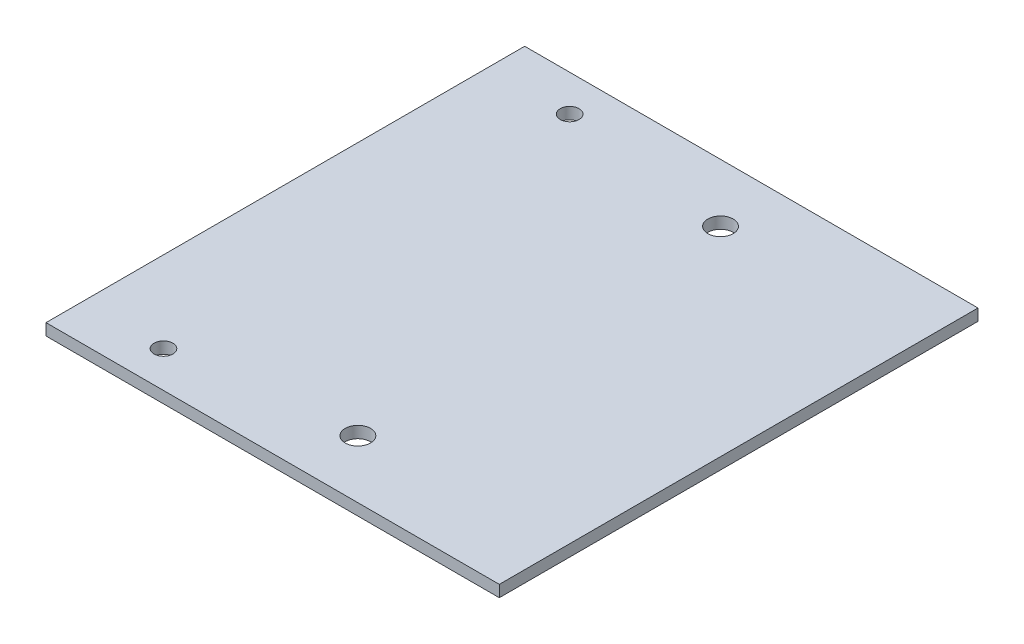
ISO-10303-21;
HEADER;
FILE_DESCRIPTION(('STEP AP214'),'2;1');
FILE_NAME('part.step','',(''),(''),'','','');
FILE_SCHEMA(('AUTOMOTIVE_DESIGN { 1 0 10303 214 1 1 1 1 }'));
ENDSEC;
DATA;
#1=APPLICATION_CONTEXT('core data for automotive mechanical design processes');
#2=APPLICATION_PROTOCOL_DEFINITION('international standard','automotive_design',2000,#1);
#3=PRODUCT_CONTEXT('',#1,'mechanical');
#4=PRODUCT('Part','Part','',(#3));
#5=PRODUCT_RELATED_PRODUCT_CATEGORY('part','',(#4));
#6=PRODUCT_DEFINITION_FORMATION('','',#4);
#7=PRODUCT_DEFINITION_CONTEXT('part definition',#1,'design');
#8=PRODUCT_DEFINITION('design','',#6,#7);
#9=PRODUCT_DEFINITION_SHAPE('','',#8);
#10=(LENGTH_UNIT() NAMED_UNIT(*) SI_UNIT(.MILLI.,.METRE.));
#11=(NAMED_UNIT(*) PLANE_ANGLE_UNIT() SI_UNIT($,.RADIAN.));
#12=(NAMED_UNIT(*) SI_UNIT($,.STERADIAN.) SOLID_ANGLE_UNIT());
#13=UNCERTAINTY_MEASURE_WITH_UNIT(LENGTH_MEASURE(1.E-05),#10,'distance_accuracy_value','');
#14=(GEOMETRIC_REPRESENTATION_CONTEXT(3) GLOBAL_UNCERTAINTY_ASSIGNED_CONTEXT((#13)) GLOBAL_UNIT_ASSIGNED_CONTEXT((#10,
#11,#12)) REPRESENTATION_CONTEXT('',''));
#15=CARTESIAN_POINT('',(0.,0.,0.));
#16=DIRECTION('',(0.,0.,1.));
#17=DIRECTION('',(1.,0.,0.));
#18=AXIS2_PLACEMENT_3D('',#15,#16,#17);
#19=CARTESIAN_POINT('',(31.25,1.6,33.));
#20=DIRECTION('',(-1.,0.,0.));
#21=DIRECTION('',(0.,0.,1.));
#22=AXIS2_PLACEMENT_3D('',#19,#20,#21);
#23=PLANE('',#22);
#24=DIRECTION('',(0.,0.,-1.));
#25=VECTOR('',#24,1.);
#26=CARTESIAN_POINT('',(31.25,0.,33.));
#27=LINE('',#26,#25);
#28=CARTESIAN_POINT('',(31.25,0.,33.));
#29=VERTEX_POINT('',#28);
#30=CARTESIAN_POINT('',(31.25,0.,-33.));
#31=VERTEX_POINT('',#30);
#32=EDGE_CURVE('E97',#29,#31,#27,.T.);
#33=ORIENTED_EDGE('',*,*,#32,.T.);
#34=DIRECTION('',(0.,-1.,0.));
#35=VECTOR('',#34,1.);
#36=CARTESIAN_POINT('',(31.25,1.6,-33.));
#37=LINE('',#36,#35);
#38=CARTESIAN_POINT('',(31.25,1.6,-33.));
#39=VERTEX_POINT('',#38);
#40=EDGE_CURVE('E11',#39,#31,#37,.T.);
#41=ORIENTED_EDGE('',*,*,#40,.F.);
#42=DIRECTION('',(0.,0.,-1.));
#43=VECTOR('',#42,1.);
#44=CARTESIAN_POINT('',(31.25,1.6,33.));
#45=LINE('',#44,#43);
#46=CARTESIAN_POINT('',(31.25,1.6,33.));
#47=VERTEX_POINT('',#46);
#48=EDGE_CURVE('E84',#47,#39,#45,.T.);
#49=ORIENTED_EDGE('',*,*,#48,.F.);
#50=DIRECTION('',(0.,-1.,0.));
#51=VECTOR('',#50,1.);
#52=CARTESIAN_POINT('',(31.25,1.6,33.));
#53=LINE('',#52,#51);
#54=EDGE_CURVE('E93',#47,#29,#53,.T.);
#55=ORIENTED_EDGE('',*,*,#54,.T.);
#56=EDGE_LOOP('',(#33,#41,#49,#55));
#57=FACE_BOUND('',#56,.T.);
#58=ADVANCED_FACE('F31',(#57),#23,.F.);
#59=CARTESIAN_POINT('',(-31.25,1.6,-33.));
#60=DIRECTION('',(0.,0.,1.));
#61=DIRECTION('',(1.,0.,0.));
#62=AXIS2_PLACEMENT_3D('',#59,#60,#61);
#63=PLANE('',#62);
#64=DIRECTION('',(-1.,0.,0.));
#65=VECTOR('',#64,1.);
#66=CARTESIAN_POINT('',(-31.25,0.,-33.));
#67=LINE('',#66,#65);
#68=CARTESIAN_POINT('',(-31.25,0.,-33.));
#69=VERTEX_POINT('',#68);
#70=EDGE_CURVE('E88',#31,#69,#67,.T.);
#71=ORIENTED_EDGE('',*,*,#70,.T.);
#72=DIRECTION('',(0.,-1.,0.));
#73=VECTOR('',#72,1.);
#74=CARTESIAN_POINT('',(-31.25,1.6,-33.));
#75=LINE('',#74,#73);
#76=CARTESIAN_POINT('',(-31.25,1.6,-33.));
#77=VERTEX_POINT('',#76);
#78=EDGE_CURVE('E40',#77,#69,#75,.T.);
#79=ORIENTED_EDGE('',*,*,#78,.F.);
#80=DIRECTION('',(-1.,0.,0.));
#81=VECTOR('',#80,1.);
#82=CARTESIAN_POINT('',(-31.25,1.6,-33.));
#83=LINE('',#82,#81);
#84=EDGE_CURVE('E79',#39,#77,#83,.T.);
#85=ORIENTED_EDGE('',*,*,#84,.F.);
#86=ORIENTED_EDGE('',*,*,#40,.T.);
#87=EDGE_LOOP('',(#71,#79,#85,#86));
#88=FACE_BOUND('',#87,.T.);
#89=ADVANCED_FACE('F87',(#88),#63,.F.);
#90=CARTESIAN_POINT('',(-31.25,1.6,33.));
#91=DIRECTION('',(1.,0.,0.));
#92=DIRECTION('',(0.,0.,-1.));
#93=AXIS2_PLACEMENT_3D('',#90,#91,#92);
#94=PLANE('',#93);
#95=DIRECTION('',(0.,0.,1.));
#96=VECTOR('',#95,1.);
#97=CARTESIAN_POINT('',(-31.25,0.,33.));
#98=LINE('',#97,#96);
#99=CARTESIAN_POINT('',(-31.25,0.,33.));
#100=VERTEX_POINT('',#99);
#101=EDGE_CURVE('E66',#69,#100,#98,.T.);
#102=ORIENTED_EDGE('',*,*,#101,.T.);
#103=DIRECTION('',(0.,-1.,0.));
#104=VECTOR('',#103,1.);
#105=CARTESIAN_POINT('',(-31.25,1.6,33.));
#106=LINE('',#105,#104);
#107=CARTESIAN_POINT('',(-31.25,1.6,33.));
#108=VERTEX_POINT('',#107);
#109=EDGE_CURVE('E89',#108,#100,#106,.T.);
#110=ORIENTED_EDGE('',*,*,#109,.F.);
#111=DIRECTION('',(0.,0.,1.));
#112=VECTOR('',#111,1.);
#113=CARTESIAN_POINT('',(-31.25,1.6,33.));
#114=LINE('',#113,#112);
#115=EDGE_CURVE('E82',#77,#108,#114,.T.);
#116=ORIENTED_EDGE('',*,*,#115,.F.);
#117=ORIENTED_EDGE('',*,*,#78,.T.);
#118=EDGE_LOOP('',(#102,#110,#116,#117));
#119=FACE_BOUND('',#118,.T.);
#120=ADVANCED_FACE('F91',(#119),#94,.F.);
#121=CARTESIAN_POINT('',(-31.25,1.6,33.));
#122=DIRECTION('',(0.,0.,-1.));
#123=DIRECTION('',(-1.,0.,0.));
#124=AXIS2_PLACEMENT_3D('',#121,#122,#123);
#125=PLANE('',#124);
#126=DIRECTION('',(1.,0.,0.));
#127=VECTOR('',#126,1.);
#128=CARTESIAN_POINT('',(-31.25,0.,33.));
#129=LINE('',#128,#127);
#130=EDGE_CURVE('E72',#100,#29,#129,.T.);
#131=ORIENTED_EDGE('',*,*,#130,.T.);
#132=ORIENTED_EDGE('',*,*,#54,.F.);
#133=DIRECTION('',(1.,0.,0.));
#134=VECTOR('',#133,1.);
#135=CARTESIAN_POINT('',(-31.25,1.6,33.));
#136=LINE('',#135,#134);
#137=EDGE_CURVE('E49',#108,#47,#136,.T.);
#138=ORIENTED_EDGE('',*,*,#137,.F.);
#139=ORIENTED_EDGE('',*,*,#109,.T.);
#140=EDGE_LOOP('',(#131,#132,#138,#139));
#141=FACE_BOUND('',#140,.T.);
#142=ADVANCED_FACE('F136',(#141),#125,.F.);
#143=CARTESIAN_POINT('',(31.25,1.6,-33.));
#144=DIRECTION('',(0.,-1.,0.));
#145=DIRECTION('',(0.,0.,-1.));
#146=AXIS2_PLACEMENT_3D('',#143,#144,#145);
#147=PLANE('',#146);
#148=CARTESIAN_POINT('',(3.75,1.6,25.));
#149=DIRECTION('',(0.,1.,0.));
#150=DIRECTION('',(0.,0.,1.));
#151=AXIS2_PLACEMENT_3D('',#148,#149,#150);
#152=CIRCLE('',#151,1.75);
#153=CARTESIAN_POINT('',(3.75,1.6,26.75));
#154=VERTEX_POINT('',#153);
#155=EDGE_CURVE('E122',#154,#154,#152,.T.);
#156=ORIENTED_EDGE('',*,*,#155,.F.);
#157=EDGE_LOOP('',(#156));
#158=FACE_BOUND('',#157,.T.);
#159=CARTESIAN_POINT('',(3.75,1.6,-25.));
#160=DIRECTION('',(0.,1.,0.));
#161=DIRECTION('',(0.,0.,1.));
#162=AXIS2_PLACEMENT_3D('',#159,#160,#161);
#163=CIRCLE('',#162,1.75);
#164=CARTESIAN_POINT('',(3.75,1.6,-23.25));
#165=VERTEX_POINT('',#164);
#166=EDGE_CURVE('E118',#165,#165,#163,.T.);
#167=ORIENTED_EDGE('',*,*,#166,.F.);
#168=EDGE_LOOP('',(#167));
#169=FACE_BOUND('',#168,.T.);
#170=CARTESIAN_POINT('',(-20.052,1.6,28.));
#171=DIRECTION('',(0.,1.,0.));
#172=DIRECTION('',(0.,0.,1.));
#173=AXIS2_PLACEMENT_3D('',#170,#171,#172);
#174=CIRCLE('',#173,1.3);
#175=CARTESIAN_POINT('',(-20.052,1.6,29.3));
#176=VERTEX_POINT('',#175);
#177=EDGE_CURVE('E114',#176,#176,#174,.T.);
#178=ORIENTED_EDGE('',*,*,#177,.F.);
#179=EDGE_LOOP('',(#178));
#180=FACE_BOUND('',#179,.T.);
#181=CARTESIAN_POINT('',(-20.052,1.6,-28.));
#182=DIRECTION('',(0.,1.,0.));
#183=DIRECTION('',(0.,0.,1.));
#184=AXIS2_PLACEMENT_3D('',#181,#182,#183);
#185=CIRCLE('',#184,1.3);
#186=CARTESIAN_POINT('',(-20.052,1.6,-26.7));
#187=VERTEX_POINT('',#186);
#188=EDGE_CURVE('E106',#187,#187,#185,.T.);
#189=ORIENTED_EDGE('',*,*,#188,.F.);
#190=EDGE_LOOP('',(#189));
#191=FACE_BOUND('',#190,.T.);
#192=ORIENTED_EDGE('',*,*,#48,.T.);
#193=ORIENTED_EDGE('',*,*,#84,.T.);
#194=ORIENTED_EDGE('',*,*,#115,.T.);
#195=ORIENTED_EDGE('',*,*,#137,.T.);
#196=EDGE_LOOP('',(#192,#193,#194,#195));
#197=FACE_BOUND('',#196,.T.);
#198=ADVANCED_FACE('F80',(#158,#169,#180,#191,#197),#147,.F.);
#199=CARTESIAN_POINT('',(31.25,0.,-33.));
#200=DIRECTION('',(0.,-1.,0.));
#201=DIRECTION('',(0.,0.,-1.));
#202=AXIS2_PLACEMENT_3D('',#199,#200,#201);
#203=PLANE('',#202);
#204=CARTESIAN_POINT('',(3.75,0.,25.));
#205=DIRECTION('',(0.,-1.,0.));
#206=DIRECTION('',(0.,0.,-1.));
#207=AXIS2_PLACEMENT_3D('',#204,#205,#206);
#208=CIRCLE('',#207,1.75);
#209=CARTESIAN_POINT('',(3.75,0.,23.25));
#210=VERTEX_POINT('',#209);
#211=EDGE_CURVE('E125',#210,#210,#208,.F.);
#212=ORIENTED_EDGE('',*,*,#211,.T.);
#213=EDGE_LOOP('',(#212));
#214=FACE_BOUND('',#213,.T.);
#215=CARTESIAN_POINT('',(3.75,0.,-25.));
#216=DIRECTION('',(0.,-1.,0.));
#217=DIRECTION('',(0.,0.,-1.));
#218=AXIS2_PLACEMENT_3D('',#215,#216,#217);
#219=CIRCLE('',#218,1.75);
#220=CARTESIAN_POINT('',(3.75,0.,-26.75));
#221=VERTEX_POINT('',#220);
#222=EDGE_CURVE('E119',#221,#221,#219,.F.);
#223=ORIENTED_EDGE('',*,*,#222,.T.);
#224=EDGE_LOOP('',(#223));
#225=FACE_BOUND('',#224,.T.);
#226=CARTESIAN_POINT('',(-20.052,0.,28.));
#227=DIRECTION('',(0.,-1.,0.));
#228=DIRECTION('',(0.,0.,-1.));
#229=AXIS2_PLACEMENT_3D('',#226,#227,#228);
#230=CIRCLE('',#229,1.3);
#231=CARTESIAN_POINT('',(-20.052,0.,26.7));
#232=VERTEX_POINT('',#231);
#233=EDGE_CURVE('E34',#232,#232,#230,.T.);
#234=ORIENTED_EDGE('',*,*,#233,.F.);
#235=EDGE_LOOP('',(#234));
#236=FACE_BOUND('',#235,.T.);
#237=CARTESIAN_POINT('',(-20.052,0.,-28.));
#238=DIRECTION('',(0.,-1.,0.));
#239=DIRECTION('',(0.,0.,-1.));
#240=AXIS2_PLACEMENT_3D('',#237,#238,#239);
#241=CIRCLE('',#240,1.3);
#242=CARTESIAN_POINT('',(-20.052,0.,-29.3));
#243=VERTEX_POINT('',#242);
#244=EDGE_CURVE('E100',#243,#243,#241,.T.);
#245=ORIENTED_EDGE('',*,*,#244,.F.);
#246=EDGE_LOOP('',(#245));
#247=FACE_BOUND('',#246,.T.);
#248=ORIENTED_EDGE('',*,*,#32,.F.);
#249=ORIENTED_EDGE('',*,*,#130,.F.);
#250=ORIENTED_EDGE('',*,*,#101,.F.);
#251=ORIENTED_EDGE('',*,*,#70,.F.);
#252=EDGE_LOOP('',(#248,#249,#250,#251));
#253=FACE_BOUND('',#252,.T.);
#254=ADVANCED_FACE('F135',(#214,#225,#236,#247,#253),#203,.T.);
#255=CARTESIAN_POINT('',(-20.052,-8.4,-28.));
#256=DIRECTION('',(0.,1.,0.));
#257=DIRECTION('',(0.,0.,1.));
#258=AXIS2_PLACEMENT_3D('',#255,#256,#257);
#259=CYLINDRICAL_SURFACE('',#258,1.3);
#260=ORIENTED_EDGE('',*,*,#244,.T.);
#261=EDGE_LOOP('',(#260));
#262=FACE_BOUND('',#261,.T.);
#263=ORIENTED_EDGE('',*,*,#188,.T.);
#264=EDGE_LOOP('',(#263));
#265=FACE_BOUND('',#264,.T.);
#266=ADVANCED_FACE('F146',(#262,#265),#259,.F.);
#267=CARTESIAN_POINT('',(-20.052,-8.4,28.));
#268=DIRECTION('',(0.,1.,0.));
#269=DIRECTION('',(0.,0.,1.));
#270=AXIS2_PLACEMENT_3D('',#267,#268,#269);
#271=CYLINDRICAL_SURFACE('',#270,1.3);
#272=ORIENTED_EDGE('',*,*,#233,.T.);
#273=EDGE_LOOP('',(#272));
#274=FACE_BOUND('',#273,.T.);
#275=ORIENTED_EDGE('',*,*,#177,.T.);
#276=EDGE_LOOP('',(#275));
#277=FACE_BOUND('',#276,.T.);
#278=ADVANCED_FACE('F143',(#274,#277),#271,.F.);
#279=CARTESIAN_POINT('',(3.75,-0.000999999999999916,-25.));
#280=DIRECTION('',(0.,1.,0.));
#281=DIRECTION('',(0.,0.,1.));
#282=AXIS2_PLACEMENT_3D('',#279,#280,#281);
#283=CYLINDRICAL_SURFACE('',#282,1.75);
#284=ORIENTED_EDGE('',*,*,#222,.F.);
#285=EDGE_LOOP('',(#284));
#286=FACE_BOUND('',#285,.T.);
#287=ORIENTED_EDGE('',*,*,#166,.T.);
#288=EDGE_LOOP('',(#287));
#289=FACE_BOUND('',#288,.T.);
#290=ADVANCED_FACE('F145',(#286,#289),#283,.F.);
#291=CARTESIAN_POINT('',(3.75,-0.000999999999999916,25.));
#292=DIRECTION('',(0.,1.,0.));
#293=DIRECTION('',(0.,0.,1.));
#294=AXIS2_PLACEMENT_3D('',#291,#292,#293);
#295=CYLINDRICAL_SURFACE('',#294,1.75);
#296=ORIENTED_EDGE('',*,*,#211,.F.);
#297=EDGE_LOOP('',(#296));
#298=FACE_BOUND('',#297,.T.);
#299=ORIENTED_EDGE('',*,*,#155,.T.);
#300=EDGE_LOOP('',(#299));
#301=FACE_BOUND('',#300,.T.);
#302=ADVANCED_FACE('F131',(#298,#301),#295,.F.);
#303=CLOSED_SHELL('',(#58,#89,#120,#142,#198,#254,#266,#278,#290,#302));
#304=MANIFOLD_SOLID_BREP('B2',#303);
#305=ADVANCED_BREP_SHAPE_REPRESENTATION('',(#18,#304),#14);
#306=SHAPE_DEFINITION_REPRESENTATION(#9,#305);
ENDSEC;
END-ISO-10303-21;
